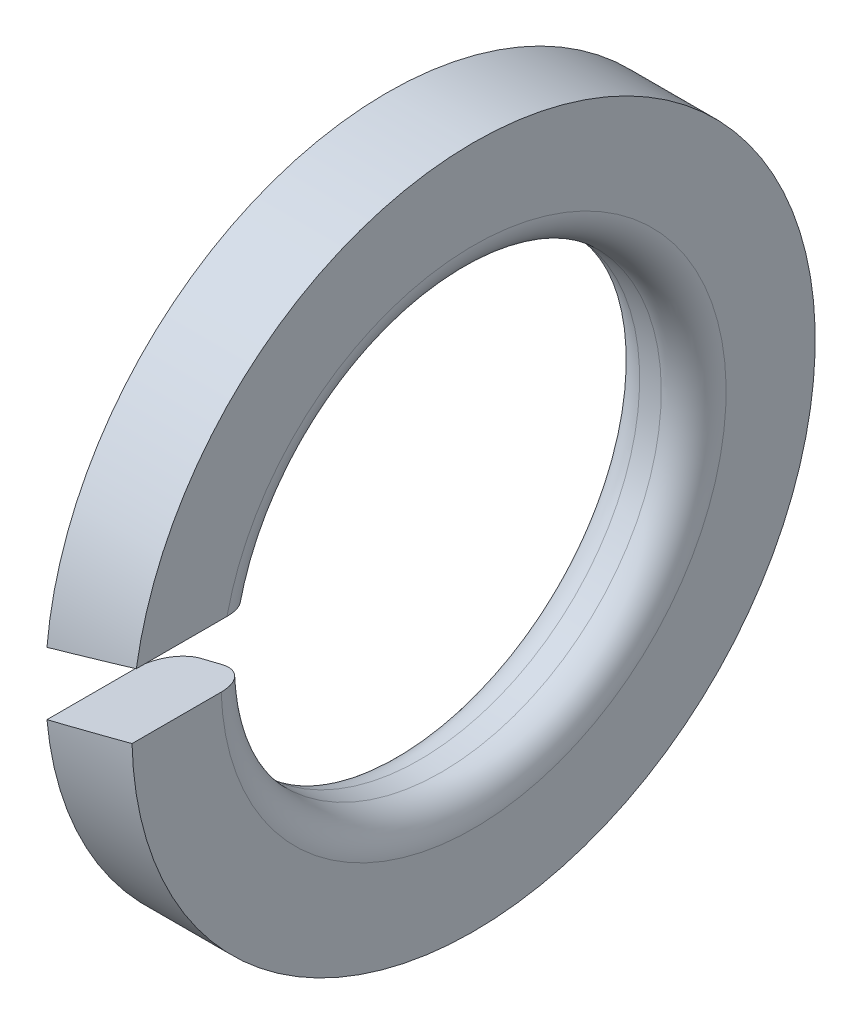
ISO-10303-21;
HEADER;
FILE_DESCRIPTION(('STEP AP214'),'2;1');
FILE_NAME('part.step','',(''),(''),'','','');
FILE_SCHEMA(('AUTOMOTIVE_DESIGN { 1 0 10303 214 1 1 1 1 }'));
ENDSEC;
DATA;
#1=APPLICATION_CONTEXT('core data for automotive mechanical design processes');
#2=APPLICATION_PROTOCOL_DEFINITION('international standard','automotive_design',2000,#1);
#3=PRODUCT_CONTEXT('',#1,'mechanical');
#4=PRODUCT('Part','Part','',(#3));
#5=PRODUCT_RELATED_PRODUCT_CATEGORY('part','',(#4));
#6=PRODUCT_DEFINITION_FORMATION('','',#4);
#7=PRODUCT_DEFINITION_CONTEXT('part definition',#1,'design');
#8=PRODUCT_DEFINITION('design','',#6,#7);
#9=PRODUCT_DEFINITION_SHAPE('','',#8);
#10=(LENGTH_UNIT() NAMED_UNIT(*) SI_UNIT(.MILLI.,.METRE.));
#11=(NAMED_UNIT(*) PLANE_ANGLE_UNIT() SI_UNIT($,.RADIAN.));
#12=(NAMED_UNIT(*) SI_UNIT($,.STERADIAN.) SOLID_ANGLE_UNIT());
#13=UNCERTAINTY_MEASURE_WITH_UNIT(LENGTH_MEASURE(1.E-05),#10,'distance_accuracy_value','');
#14=(GEOMETRIC_REPRESENTATION_CONTEXT(3) GLOBAL_UNCERTAINTY_ASSIGNED_CONTEXT((#13)) GLOBAL_UNIT_ASSIGNED_CONTEXT((#10,
#11,#12)) REPRESENTATION_CONTEXT('',''));
#15=CARTESIAN_POINT('',(0.,0.,0.));
#16=DIRECTION('',(0.,0.,1.));
#17=DIRECTION('',(1.,0.,0.));
#18=AXIS2_PLACEMENT_3D('',#15,#16,#17);
#19=CARTESIAN_POINT('',(0.,0.,12.65));
#20=DIRECTION('',(1.,0.,0.));
#21=DIRECTION('',(0.,0.,-1.));
#22=AXIS2_PLACEMENT_3D('',#19,#20,#21);
#23=PLANE('',#22);
#24=CARTESIAN_POINT('',(0.,0.,0.));
#25=DIRECTION('',(-1.,0.,0.));
#26=DIRECTION('',(0.,0.,1.));
#27=AXIS2_PLACEMENT_3D('',#24,#25,#26);
#28=CIRCLE('',#27,9.35);
#29=CARTESIAN_POINT('',(0.,1.15950932205929,9.27782507552592));
#30=VERTEX_POINT('',#29);
#31=CARTESIAN_POINT('',(0.,-1.15950932205929,9.27782507552592));
#32=VERTEX_POINT('',#31);
#33=EDGE_CURVE('E98',#30,#32,#28,.T.);
#34=ORIENTED_EDGE('',*,*,#33,.F.);
#35=DIRECTION('',(0.,0.,-1.));
#36=VECTOR('',#35,1.);
#37=CARTESIAN_POINT('',(0.,1.15950932205929,12.65));
#38=LINE('',#37,#36);
#39=CARTESIAN_POINT('',(0.,1.15950932205929,12.5967471250342));
#40=VERTEX_POINT('',#39);
#41=EDGE_CURVE('E128',#40,#30,#38,.T.);
#42=ORIENTED_EDGE('',*,*,#41,.F.);
#43=CARTESIAN_POINT('',(0.,0.,0.));
#44=DIRECTION('',(-1.,0.,0.));
#45=DIRECTION('',(0.,0.,1.));
#46=AXIS2_PLACEMENT_3D('',#43,#44,#45);
#47=CIRCLE('',#46,12.65);
#48=CARTESIAN_POINT('',(0.,-1.15950932205929,12.5967471250342));
#49=VERTEX_POINT('',#48);
#50=EDGE_CURVE('E131',#40,#49,#47,.T.);
#51=ORIENTED_EDGE('',*,*,#50,.T.);
#52=DIRECTION('',(0.,0.,1.));
#53=VECTOR('',#52,1.);
#54=CARTESIAN_POINT('',(0.,-1.15950932205929,12.65));
#55=LINE('',#54,#53);
#56=EDGE_CURVE('E114',#32,#49,#55,.T.);
#57=ORIENTED_EDGE('',*,*,#56,.F.);
#58=EDGE_LOOP('',(#34,#42,#51,#57));
#59=FACE_BOUND('',#58,.T.);
#60=ADVANCED_FACE('F35',(#59),#23,.F.);
#61=CARTESIAN_POINT('',(1.,0.,0.));
#62=DIRECTION('',(-1.,0.,0.));
#63=DIRECTION('',(0.,0.,1.));
#64=AXIS2_PLACEMENT_3D('',#61,#62,#63);
#65=CYLINDRICAL_SURFACE('',#64,8.15);
#66=CARTESIAN_POINT('',(-4.32734770177503,0.,0.));
#67=DIRECTION('',(0.258819045102521,-0.965925826289068,0.));
#68=DIRECTION('',(-0.965925826289068,-0.258819045102521,0.));
#69=AXIS2_PLACEMENT_3D('',#66,#67,#68);
#70=ELLIPSE('',#69,31.4891819370236,8.15);
#71=CARTESIAN_POINT('',(1.2,1.48104835297664,8.01429945635582));
#72=VERTEX_POINT('',#71);
#73=CARTESIAN_POINT('',(2.,1.69540770692154,7.97170575895216));
#74=VERTEX_POINT('',#73);
#75=EDGE_CURVE('E125',#72,#74,#70,.F.);
#76=ORIENTED_EDGE('',*,*,#75,.F.);
#77=CARTESIAN_POINT('',(1.2,0.,0.));
#78=DIRECTION('',(-1.,0.,0.));
#79=DIRECTION('',(0.,0.,1.));
#80=AXIS2_PLACEMENT_3D('',#77,#78,#79);
#81=CIRCLE('',#80,8.15);
#82=CARTESIAN_POINT('',(1.2,-0.837970291141946,8.10680613997668));
#83=VERTEX_POINT('',#82);
#84=EDGE_CURVE('E62',#72,#83,#81,.T.);
#85=ORIENTED_EDGE('',*,*,#84,.T.);
#86=CARTESIAN_POINT('',(4.32734770177503,0.,0.));
#87=DIRECTION('',(-0.258819045102521,0.965925826289068,0.));
#88=DIRECTION('',(-0.965925826289068,-0.258819045102521,0.));
#89=AXIS2_PLACEMENT_3D('',#86,#87,#88);
#90=ELLIPSE('',#89,31.4891819370236,8.15);
#91=CARTESIAN_POINT('',(2.,-0.623610937197048,8.12610665688115));
#92=VERTEX_POINT('',#91);
#93=EDGE_CURVE('E112',#92,#83,#90,.F.);
#94=ORIENTED_EDGE('',*,*,#93,.F.);
#95=CARTESIAN_POINT('',(2.,0.,0.));
#96=DIRECTION('',(-1.,0.,0.));
#97=DIRECTION('',(0.,0.,1.));
#98=AXIS2_PLACEMENT_3D('',#95,#96,#97);
#99=CIRCLE('',#98,8.15);
#100=EDGE_CURVE('E92',#74,#92,#99,.T.);
#101=ORIENTED_EDGE('',*,*,#100,.F.);
#102=EDGE_LOOP('',(#76,#85,#94,#101));
#103=FACE_BOUND('',#102,.T.);
#104=ADVANCED_FACE('F158',(#103),#65,.F.);
#105=CARTESIAN_POINT('',(-3.2,-2.01694673783889,32.6));
#106=DIRECTION('',(-0.258819045102521,0.965925826289068,0.));
#107=DIRECTION('',(-0.965925826289068,-0.258819045102521,0.));
#108=AXIS2_PLACEMENT_3D('',#105,#106,#107);
#109=PLANE('',#108);
#110=ORIENTED_EDGE('',*,*,#93,.T.);
#111=CARTESIAN_POINT('',(1.2002,-0.83791670130346,8.10681169593468));
#112=CARTESIAN_POINT('',(1.16615518889266,-0.847038980946141,8.10586428813486));
#113=CARTESIAN_POINT('',(1.1320873452314,-0.856167432143045,8.10635579334355));
#114=CARTESIAN_POINT('',(1.06410047134165,-0.87438446009772,8.11023748620602));
#115=CARTESIAN_POINT('',(1.03018146846454,-0.883473029526712,8.11362818590367));
#116=CARTESIAN_POINT('',(0.928932755192387,-0.910602540482675,8.12818378286438));
#117=CARTESIAN_POINT('',(0.862137375950527,-0.928500308408662,8.1437329263082));
#118=CARTESIAN_POINT('',(0.731984157066175,-0.963374758301035,8.18638895924579));
#119=CARTESIAN_POINT('',(0.66863195921221,-0.980349928554742,8.2135142090576));
#120=CARTESIAN_POINT('',(0.547504108033045,-1.01280603845912,8.27878824458666));
#121=CARTESIAN_POINT('',(0.48972362673674,-1.02828827176074,8.31692737002153));
#122=CARTESIAN_POINT('',(0.38361768409047,-1.05671927340495,8.40171986265044));
#123=CARTESIAN_POINT('',(0.335026500559753,-1.06973924179128,8.44801681011798));
#124=CARTESIAN_POINT('',(0.246421800769299,-1.09348079954574,8.54871271750761));
#125=CARTESIAN_POINT('',(0.206407376712343,-1.10420263215739,8.60311081893842));
#126=CARTESIAN_POINT('',(0.137667980053884,-1.12262129798023,8.71610189268561));
#127=CARTESIAN_POINT('',(0.108562308402124,-1.13042013919449,8.7744472088211));
#128=CARTESIAN_POINT('',(0.0603481415466495,-1.14333908626715,8.89541669055038));
#129=CARTESIAN_POINT('',(0.0412389431422889,-1.1484593805476,8.95804055481974));
#130=CARTESIAN_POINT('',(0.0156991920644277,-1.15530273622381,9.07562890112463));
#131=CARTESIAN_POINT('',(0.00774571692155469,-1.15743386346536,9.13024615787941));
#132=CARTESIAN_POINT('',(-0.000670990744321338,-1.15968911348736,9.24005337620748));
#133=CARTESIAN_POINT('',(-0.00114013842154255,-1.1598148212286,9.29524285100825));
#134=CARTESIAN_POINT('',(0.00214693109826549,-1.15893405360531,9.3502));
#135=B_SPLINE_CURVE_WITH_KNOTS('',3,(#111,#112,#113,#114,#115,#116,#117,#118,#119,#120,#121,
#122,#123,#124,#125,#126,#127,#128,#129,#130,#131,#132,#133,#134),.UNSPECIFIED.,.F.,.F.,(4,2,2,
2,2,2,2,2,2,2,2,4),(0.,0.105715323805548,0.211449322477086,0.42299722212637,0.634881902264848,
0.84658129965824,1.05065051989092,1.25469812997455,1.45075607442049,1.64680022533992,
1.81196555834644,1.97700034831287),.UNSPECIFIED.);
#136=EDGE_CURVE('E97',#83,#32,#135,.T.);
#137=ORIENTED_EDGE('',*,*,#136,.T.);
#138=ORIENTED_EDGE('',*,*,#56,.T.);
#139=CARTESIAN_POINT('',(4.32734770177503,0.,0.));
#140=DIRECTION('',(-0.258819045102521,0.965925826289068,0.));
#141=DIRECTION('',(-0.965925826289068,-0.258819045102521,0.));
#142=AXIS2_PLACEMENT_3D('',#139,#140,#141);
#143=ELLIPSE('',#142,48.8758468102269,12.65);
#144=CARTESIAN_POINT('',(3.2,-0.3020719062797,12.6463928676693));
#145=VERTEX_POINT('',#144);
#146=EDGE_CURVE('E111',#49,#145,#143,.T.);
#147=ORIENTED_EDGE('',*,*,#146,.T.);
#148=DIRECTION('',(0.,0.,-1.));
#149=VECTOR('',#148,1.);
#150=CARTESIAN_POINT('',(3.2,-0.3020719062797,8.15));
#151=LINE('',#150,#149);
#152=CARTESIAN_POINT('',(3.2,-0.3020719062797,9.34511918401454));
#153=VERTEX_POINT('',#152);
#154=EDGE_CURVE('E105',#145,#153,#151,.T.);
#155=ORIENTED_EDGE('',*,*,#154,.T.);
#156=CARTESIAN_POINT('',(3.19998925465781,-0.302074785485462,9.3502));
#157=CARTESIAN_POINT('',(3.20013012863944,-0.30203703841585,9.31699934587778));
#158=CARTESIAN_POINT('',(3.19889257980905,-0.302368638625548,9.28380916320653));
#159=CARTESIAN_POINT('',(3.19368553679829,-0.303763861595235,9.21766466390742));
#160=CARTESIAN_POINT('',(3.18971649202091,-0.304827363938056,9.18471030938064));
#161=CARTESIAN_POINT('',(3.17378012770931,-0.309097499885638,9.08669929243439));
#162=CARTESIAN_POINT('',(3.15778406922705,-0.313383630838041,9.02229706093792));
#163=CARTESIAN_POINT('',(3.11563484646043,-0.324677481039955,8.8972132369343));
#164=CARTESIAN_POINT('',(3.08948247133195,-0.331684988835787,8.83653135577631));
#165=CARTESIAN_POINT('',(3.02791152262731,-0.348182874818415,8.72042398920298));
#166=CARTESIAN_POINT('',(2.99249107196675,-0.357673755968458,8.66499957169555));
#167=CARTESIAN_POINT('',(2.91264434061348,-0.37906862315283,8.55964152403969));
#168=CARTESIAN_POINT('',(2.8680385265027,-0.391020715021548,8.50985397485908));
#169=CARTESIAN_POINT('',(2.7716675400648,-0.416843243011373,8.41834941278762));
#170=CARTESIAN_POINT('',(2.71990003904185,-0.430714303104651,8.37663503559825));
#171=CARTESIAN_POINT('',(2.60837405867038,-0.460597599480276,8.3006404327375));
#172=CARTESIAN_POINT('',(2.54837216966852,-0.476675057182665,8.26674335407236));
#173=CARTESIAN_POINT('',(2.42386093129382,-0.510037742953764,8.20948064384681));
#174=CARTESIAN_POINT('',(2.35935280688111,-0.527322642795397,8.18611216299577));
#175=CARTESIAN_POINT('',(2.24551619332537,-0.557825071466751,8.15529831079246));
#176=CARTESIAN_POINT('',(2.19682872431341,-0.570870839470021,8.14525118138642));
#177=CARTESIAN_POINT('',(2.09871987593968,-0.597159026162111,8.1311597063344));
#178=CARTESIAN_POINT('',(2.04929961722895,-0.610401144573387,8.1271069919394));
#179=CARTESIAN_POINT('',(1.99979999999986,-0.62366452703557,8.12610256084577));
#180=B_SPLINE_CURVE_WITH_KNOTS('',3,(#156,#157,#158,#159,#160,#161,#162,#163,#164,#165,#166,
#167,#168,#169,#170,#171,#172,#173,#174,#175,#176,#177,#178,#179),.UNSPECIFIED.,.F.,.F.,(4,2,2,
2,2,2,2,2,2,2,2,4),(0.,0.099539554173873,0.199062735384532,0.397523980569789,0.59596980820387,
0.794455858673772,0.997269956844687,1.20015015778001,1.41150172977174,1.62279607056197,
1.7766468870957,1.93028271048247),.UNSPECIFIED.);
#181=EDGE_CURVE('E89',#153,#92,#180,.T.);
#182=ORIENTED_EDGE('',*,*,#181,.T.);
#183=EDGE_LOOP('',(#110,#137,#138,#147,#155,#182));
#184=FACE_BOUND('',#183,.T.);
#185=ADVANCED_FACE('F109',(#184),#109,.T.);
#186=CARTESIAN_POINT('',(4.85,2.45906290535024,32.6));
#187=DIRECTION('',(0.258819045102521,-0.965925826289068,0.));
#188=DIRECTION('',(0.965925826289068,0.258819045102521,0.));
#189=AXIS2_PLACEMENT_3D('',#186,#187,#188);
#190=PLANE('',#189);
#191=ORIENTED_EDGE('',*,*,#41,.T.);
#192=CARTESIAN_POINT('',(0.00215543752953346,1.16008686980467,9.3502));
#193=CARTESIAN_POINT('',(0.000128031325780167,1.15954362794964,9.31623684443487));
#194=CARTESIAN_POINT('',(-0.000465517714761119,1.15938458696356,9.28220052950744));
#195=CARTESIAN_POINT('',(0.00118485300275254,1.15982680246453,9.21421071043272));
#196=CARTESIAN_POINT('',(0.00342799255579603,1.16042784989628,9.18025718608768));
#197=CARTESIAN_POINT('',(0.0143410880574288,1.16335200502286,9.0790729030567));
#198=CARTESIAN_POINT('',(0.0271810207183576,1.16679245461023,9.01227757759068));
#199=CARTESIAN_POINT('',(0.0633721700177946,1.17648984383817,8.88191013747556));
#200=CARTESIAN_POINT('',(0.0867171497725401,1.18274511231077,8.81833613519671));
#201=CARTESIAN_POINT('',(0.14303464069268,1.19783533852257,8.69591089812681));
#202=CARTESIAN_POINT('',(0.176011443011091,1.20667144607275,8.63706178329004));
#203=CARTESIAN_POINT('',(0.251850842562507,1.22699255193701,8.52350207118587));
#204=CARTESIAN_POINT('',(0.295024568685799,1.23856091698599,8.46901448151847));
#205=CARTESIAN_POINT('',(0.389236699536305,1.2638049813646,8.36787961705392));
#206=CARTESIAN_POINT('',(0.44027780342244,1.27748140393168,8.32123504458496));
#207=CARTESIAN_POINT('',(0.551394648824131,1.30725507292256,8.23486152234758));
#208=CARTESIAN_POINT('',(0.611783597220525,1.32343624287714,8.19556420672346));
#209=CARTESIAN_POINT('',(0.737962635849181,1.35724581437942,8.12778362715559));
#210=CARTESIAN_POINT('',(0.80375054904426,1.37487363259177,8.09929603019019));
#211=CARTESIAN_POINT('',(0.92453048046482,1.4072365176778,8.05881095979686));
#212=CARTESIAN_POINT('',(0.978837512297524,1.4217880430007,8.04459359940184));
#213=CARTESIAN_POINT('',(1.08875702713622,1.45124088823415,8.02370773963798));
#214=CARTESIAN_POINT('',(1.14436881485608,1.46614202184334,8.01703530893195));
#215=CARTESIAN_POINT('',(1.20020000000147,1.48110194281552,8.01428956967832));
#216=B_SPLINE_CURVE_WITH_KNOTS('',3,(#192,#193,#194,#195,#196,#197,#198,#199,#200,#201,#202,
#203,#204,#205,#206,#207,#208,#209,#210,#211,#212,#213,#214,#215),.UNSPECIFIED.,.F.,.F.,(4,2,2,
2,2,2,2,2,2,2,2,4),(0.,0.102015993998348,0.204003935540797,0.407265569170923,0.610406684539884,
0.813638441397497,1.02413190399771,1.23469774460672,1.45522646747623,1.6756666988938,
1.84915597347174,2.02255480856146),.UNSPECIFIED.);
#217=EDGE_CURVE('E11',#30,#72,#216,.T.);
#218=ORIENTED_EDGE('',*,*,#217,.T.);
#219=ORIENTED_EDGE('',*,*,#75,.T.);
#220=CARTESIAN_POINT('',(1.9998,1.69535411708305,7.9717171731915));
#221=CARTESIAN_POINT('',(2.03272864293446,1.70417732036519,7.96983611299675));
#222=CARTESIAN_POINT('',(2.06571762372162,1.71301669112624,7.96932098567039));
#223=CARTESIAN_POINT('',(2.13163555996524,1.73067934890944,7.97106784446309));
#224=CARTESIAN_POINT('',(2.16456449588407,1.73950263069651,7.97333061331198));
#225=CARTESIAN_POINT('',(2.26301637574476,1.76588273239851,7.98436021446332));
#226=CARTESIAN_POINT('',(2.32814920744862,1.78333502205431,7.99737161214024));
#227=CARTESIAN_POINT('',(2.45543295962383,1.81744060065926,8.03476119768319));
#228=CARTESIAN_POINT('',(2.51757732740133,1.83409213381938,8.059163210397));
#229=CARTESIAN_POINT('',(2.63669348848917,1.86600921298837,8.11890273463718));
#230=CARTESIAN_POINT('',(2.69367138277535,1.88127639374877,8.1542271248105));
#231=CARTESIAN_POINT('',(2.79824652479174,1.90929721860043,8.23314102012196));
#232=CARTESIAN_POINT('',(2.84614369961455,1.92213122791394,8.2763049556687));
#233=CARTESIAN_POINT('',(2.93399979189749,1.94567219689131,8.37058448050963));
#234=CARTESIAN_POINT('',(2.97395757298647,1.95637885206544,8.42170120622819));
#235=CARTESIAN_POINT('',(3.04370557264971,1.97506777224889,8.52871451125712));
#236=CARTESIAN_POINT('',(3.07375833388765,1.98312038535292,8.58442821265097));
#237=CARTESIAN_POINT('',(3.12453886478628,1.99672698759843,8.70024030876754));
#238=CARTESIAN_POINT('',(3.14526538789314,2.00228064272682,8.76033928838382));
#239=CARTESIAN_POINT('',(3.17724396952594,2.01084927785042,8.88409384567684));
#240=CARTESIAN_POINT('',(3.18835469357278,2.0138263873861,8.94778828556601));
#241=CARTESIAN_POINT('',(3.20052124587702,2.01708640525069,9.07616359323147));
#242=CARTESIAN_POINT('',(3.20158569320026,2.01737162305134,9.14084356774728));
#243=CARTESIAN_POINT('',(3.19630251429667,2.01595599953065,9.22949131408659));
#244=CARTESIAN_POINT('',(3.19414850804002,2.01537883529369,9.25379019448401));
#245=CARTESIAN_POINT('',(3.18846403910169,2.01385568643227,9.30216512055848));
#246=CARTESIAN_POINT('',(3.1849363657267,2.01291044920028,9.32624151721929));
#247=CARTESIAN_POINT('',(3.18073175800295,2.01178382795621,9.3502));
#248=B_SPLINE_CURVE_WITH_KNOTS('',3,(#220,#221,#222,#223,#224,#225,#226,#227,#228,#229,#230,
#231,#232,#233,#234,#235,#236,#237,#238,#239,#240,#241,#242,#243,#244,#245,#246,#247),
.UNSPECIFIED.,.F.,.F.,(4,2,2,2,2,2,2,2,2,2,2,2,2,4),(0.,0.102371100552508,0.20477105290543,
0.40974055979768,0.615140719519672,0.820295078818779,1.01653980108769,1.21281259180339,
1.40336124484458,1.5939353592394,1.78726517493818,1.98042911086997,2.05359964588725,
2.12662237243524),.UNSPECIFIED.);
#249=CARTESIAN_POINT('',(3.2,2.01694673783889,9.1298645037438));
#250=VERTEX_POINT('',#249);
#251=EDGE_CURVE('E47',#74,#250,#248,.T.);
#252=ORIENTED_EDGE('',*,*,#251,.T.);
#253=DIRECTION('',(0.,0.,1.));
#254=VECTOR('',#253,1.);
#255=CARTESIAN_POINT('',(3.2,2.01694673783889,8.15));
#256=LINE('',#255,#254);
#257=CARTESIAN_POINT('',(3.2,2.01694673783889,12.4881714376734));
#258=VERTEX_POINT('',#257);
#259=EDGE_CURVE('E107',#250,#258,#256,.T.);
#260=ORIENTED_EDGE('',*,*,#259,.T.);
#261=CARTESIAN_POINT('',(-4.32734770177503,0.,0.));
#262=DIRECTION('',(0.258819045102521,-0.965925826289068,0.));
#263=DIRECTION('',(-0.965925826289068,-0.258819045102521,0.));
#264=AXIS2_PLACEMENT_3D('',#261,#262,#263);
#265=ELLIPSE('',#264,48.8758468102269,12.65);
#266=EDGE_CURVE('E137',#258,#40,#265,.T.);
#267=ORIENTED_EDGE('',*,*,#266,.T.);
#268=EDGE_LOOP('',(#191,#218,#219,#252,#260,#267));
#269=FACE_BOUND('',#268,.T.);
#270=ADVANCED_FACE('F142',(#269),#190,.T.);
#271=CARTESIAN_POINT('',(3.2,0.,8.15));
#272=DIRECTION('',(-1.,0.,0.));
#273=DIRECTION('',(0.,0.,1.));
#274=AXIS2_PLACEMENT_3D('',#271,#272,#273);
#275=PLANE('',#274);
#276=ORIENTED_EDGE('',*,*,#259,.F.);
#277=CARTESIAN_POINT('',(3.2,0.,0.));
#278=DIRECTION('',(-1.,0.,0.));
#279=DIRECTION('',(0.,0.,1.));
#280=AXIS2_PLACEMENT_3D('',#277,#278,#279);
#281=CIRCLE('',#280,9.35);
#282=EDGE_CURVE('E54',#250,#153,#281,.T.);
#283=ORIENTED_EDGE('',*,*,#282,.T.);
#284=ORIENTED_EDGE('',*,*,#154,.F.);
#285=CARTESIAN_POINT('',(3.2,0.,0.));
#286=DIRECTION('',(-1.,0.,0.));
#287=DIRECTION('',(0.,0.,1.));
#288=AXIS2_PLACEMENT_3D('',#285,#286,#287);
#289=CIRCLE('',#288,12.65);
#290=EDGE_CURVE('E134',#258,#145,#289,.T.);
#291=ORIENTED_EDGE('',*,*,#290,.F.);
#292=EDGE_LOOP('',(#276,#283,#284,#291));
#293=FACE_BOUND('',#292,.T.);
#294=ADVANCED_FACE('F103',(#293),#275,.F.);
#295=CARTESIAN_POINT('',(1.,0.,0.));
#296=DIRECTION('',(-1.,0.,0.));
#297=DIRECTION('',(0.,0.,1.));
#298=AXIS2_PLACEMENT_3D('',#295,#296,#297);
#299=CYLINDRICAL_SURFACE('',#298,12.65);
#300=ORIENTED_EDGE('',*,*,#266,.F.);
#301=ORIENTED_EDGE('',*,*,#290,.T.);
#302=ORIENTED_EDGE('',*,*,#146,.F.);
#303=ORIENTED_EDGE('',*,*,#50,.F.);
#304=EDGE_LOOP('',(#300,#301,#302,#303));
#305=FACE_BOUND('',#304,.T.);
#306=ADVANCED_FACE('F148',(#305),#299,.T.);
#307=CARTESIAN_POINT('',(2.,0.,0.));
#308=DIRECTION('',(-1.,0.,0.));
#309=DIRECTION('',(0.,0.,1.));
#310=AXIS2_PLACEMENT_3D('',#307,#308,#309);
#311=TOROIDAL_SURFACE('',#310,9.35,1.2);
#312=ORIENTED_EDGE('',*,*,#282,.F.);
#313=ORIENTED_EDGE('',*,*,#251,.F.);
#314=ORIENTED_EDGE('',*,*,#100,.T.);
#315=ORIENTED_EDGE('',*,*,#181,.F.);
#316=EDGE_LOOP('',(#312,#313,#314,#315));
#317=FACE_BOUND('',#316,.T.);
#318=ADVANCED_FACE('F90',(#317),#311,.T.);
#319=CARTESIAN_POINT('',(1.2,0.,0.));
#320=DIRECTION('',(-1.,0.,0.));
#321=DIRECTION('',(0.,0.,1.));
#322=AXIS2_PLACEMENT_3D('',#319,#320,#321);
#323=TOROIDAL_SURFACE('',#322,9.35,1.2);
#324=ORIENTED_EDGE('',*,*,#84,.F.);
#325=ORIENTED_EDGE('',*,*,#217,.F.);
#326=ORIENTED_EDGE('',*,*,#33,.T.);
#327=ORIENTED_EDGE('',*,*,#136,.F.);
#328=EDGE_LOOP('',(#324,#325,#326,#327));
#329=FACE_BOUND('',#328,.T.);
#330=ADVANCED_FACE('F147',(#329),#323,.T.);
#331=CLOSED_SHELL('',(#60,#104,#185,#270,#294,#306,#318,#330));
#332=MANIFOLD_SOLID_BREP('B2',#331);
#333=ADVANCED_BREP_SHAPE_REPRESENTATION('',(#18,#332),#14);
#334=SHAPE_DEFINITION_REPRESENTATION(#9,#333);
ENDSEC;
END-ISO-10303-21;
